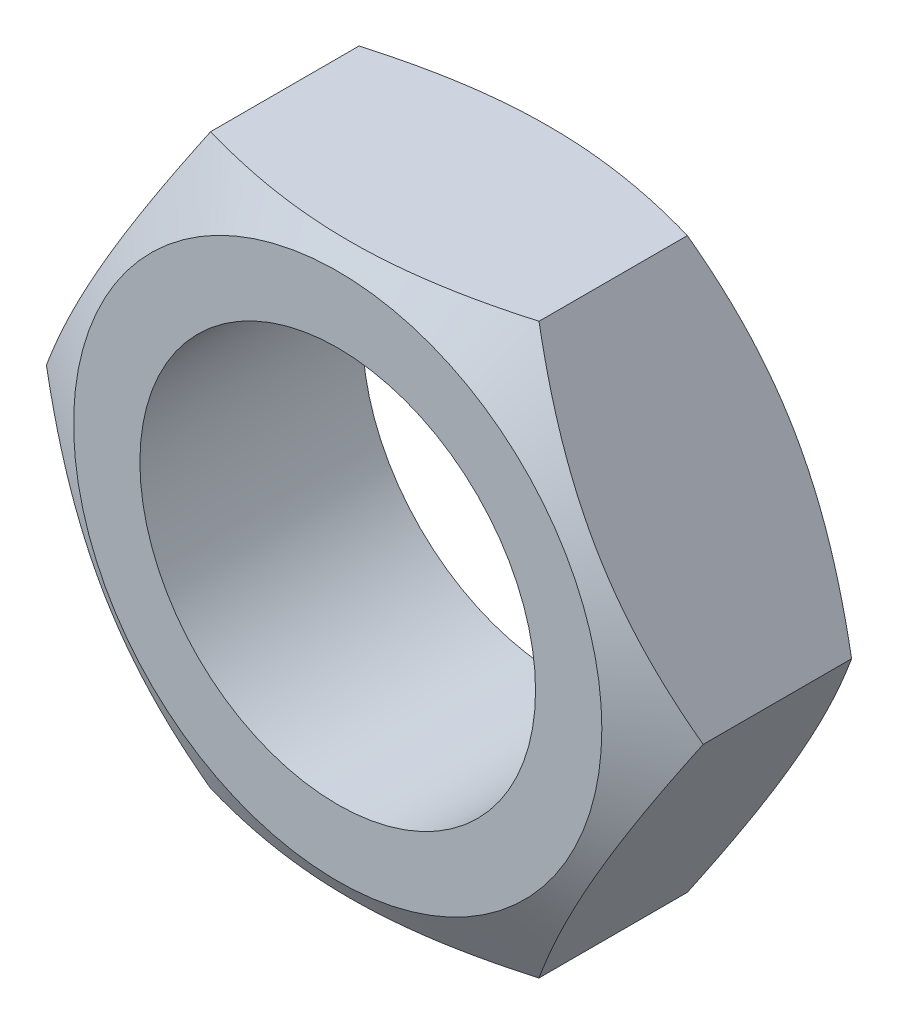
ISO-10303-21;
HEADER;
FILE_DESCRIPTION(('STEP AP214'),'2;1');
FILE_NAME('part.step','',(''),(''),'','','');
FILE_SCHEMA(('AUTOMOTIVE_DESIGN { 1 0 10303 214 1 1 1 1 }'));
ENDSEC;
DATA;
#1=APPLICATION_CONTEXT('core data for automotive mechanical design processes');
#2=APPLICATION_PROTOCOL_DEFINITION('international standard','automotive_design',2000,#1);
#3=PRODUCT_CONTEXT('',#1,'mechanical');
#4=PRODUCT('Part','Part','',(#3));
#5=PRODUCT_RELATED_PRODUCT_CATEGORY('part','',(#4));
#6=PRODUCT_DEFINITION_FORMATION('','',#4);
#7=PRODUCT_DEFINITION_CONTEXT('part definition',#1,'design');
#8=PRODUCT_DEFINITION('design','',#6,#7);
#9=PRODUCT_DEFINITION_SHAPE('','',#8);
#10=(LENGTH_UNIT() NAMED_UNIT(*) SI_UNIT(.MILLI.,.METRE.));
#11=(NAMED_UNIT(*) PLANE_ANGLE_UNIT() SI_UNIT($,.RADIAN.));
#12=(NAMED_UNIT(*) SI_UNIT($,.STERADIAN.) SOLID_ANGLE_UNIT());
#13=UNCERTAINTY_MEASURE_WITH_UNIT(LENGTH_MEASURE(1.E-05),#10,'distance_accuracy_value','');
#14=(GEOMETRIC_REPRESENTATION_CONTEXT(3) GLOBAL_UNCERTAINTY_ASSIGNED_CONTEXT((#13)) GLOBAL_UNIT_ASSIGNED_CONTEXT((#10,
#11,#12)) REPRESENTATION_CONTEXT('',''));
#15=CARTESIAN_POINT('',(0.,0.,0.));
#16=DIRECTION('',(0.,0.,1.));
#17=DIRECTION('',(1.,0.,0.));
#18=AXIS2_PLACEMENT_3D('',#15,#16,#17);
#19=CARTESIAN_POINT('',(13.2790561913614,-23.,18.));
#20=DIRECTION('',(-0.866025403784439,0.5,0.));
#21=DIRECTION('',(-0.5,-0.866025403784439,0.));
#22=AXIS2_PLACEMENT_3D('',#19,#20,#21);
#23=PLANE('',#22);
#24=CARTESIAN_POINT('',(13.2789407213076,-23.0002,14.9999333328986));
#25=CARTESIAN_POINT('',(13.5708086390754,-22.4946699373268,15.1684311500881));
#26=CARTESIAN_POINT('',(13.8638149971431,-21.9871680382127,15.3292827502776));
#27=CARTESIAN_POINT('',(14.4521772730397,-20.9680946831029,15.6335681487935));
#28=CARTESIAN_POINT('',(14.7475339297949,-20.4565219472494,15.7769962184533));
#29=CARTESIAN_POINT('',(15.3411739231066,-19.4283073174286,16.0445094164699));
#30=CARTESIAN_POINT('',(15.6394625019543,-18.9116563435469,16.168548352739));
#31=CARTESIAN_POINT('',(16.2380996675841,-17.874786357377,16.3946111991832));
#32=CARTESIAN_POINT('',(16.5384480460728,-17.3545677058636,16.4966373024589));
#33=CARTESIAN_POINT('',(17.133527657097,-16.3238595850214,16.6743436250418));
#34=CARTESIAN_POINT('',(17.4282147495145,-15.8134465686196,16.7506115189277));
#35=CARTESIAN_POINT('',(18.0189392134896,-14.7902817837407,16.8784953888596));
#36=CARTESIAN_POINT('',(18.3149766109281,-14.2775299704369,16.9301108903824));
#37=CARTESIAN_POINT('',(18.9075486924775,-13.2511650180465,17.0073867100464));
#38=CARTESIAN_POINT('',(19.2040823642676,-12.737553632351,17.0330778703644));
#39=CARTESIAN_POINT('',(19.7974233553189,-11.7098568896369,17.0579525253295));
#40=CARTESIAN_POINT('',(20.0942306658406,-11.1957715477555,17.0571368390891));
#41=CARTESIAN_POINT('',(20.649116836706,-10.2346805073992,17.0308491695729));
#42=CARTESIAN_POINT('',(20.9072352164226,-9.78760635936282,17.0085827357041));
#43=CARTESIAN_POINT('',(21.422855752054,-8.89452539422335,16.9444254503425));
#44=CARTESIAN_POINT('',(21.6803579167418,-8.448518561925,16.9025348799277));
#45=CARTESIAN_POINT('',(22.1946508831217,-7.55773701417968,16.7998553300411));
#46=CARTESIAN_POINT('',(22.4514408288437,-7.11296378131638,16.7390492612679));
#47=CARTESIAN_POINT('',(22.9637911641509,-6.22554696928937,16.5996148803772));
#48=CARTESIAN_POINT('',(23.219351558941,-5.78290338111062,16.520986643771));
#49=CARTESIAN_POINT('',(23.9951784974309,-4.4391317057654,16.2563508086476));
#50=CARTESIAN_POINT('',(24.5132407774459,-3.54182151529441,16.0439416496698));
#51=CARTESIAN_POINT('',(25.2846129731117,-2.20576568085543,15.6823250215795));
#52=CARTESIAN_POINT('',(25.5405624650353,-1.76244815667232,15.5547491239787));
#53=CARTESIAN_POINT('',(26.0506910811774,-0.878879475119287,15.2866818418769));
#54=CARTESIAN_POINT('',(26.3048706827756,-0.438627490903579,15.1461940976301));
#55=CARTESIAN_POINT('',(26.5582278527766,0.00020000000000843,14.9999333328986));
#56=B_SPLINE_CURVE_WITH_KNOTS('',3,(#24,#25,#26,#27,#28,#29,#30,#31,#32,#33,#34,#35,#36,#37,#38,
#39,#40,#41,#42,#43,#44,#45,#46,#47,#48,#49,#50,#51,#52,#53,#54,#55),.UNSPECIFIED.,.F.,.F.,(4,2,
2,2,2,2,2,2,2,2,2,2,2,2,2,4),(0.,1.82275209583971,3.64610187987774,5.47373144334345,
7.30117883905959,9.08355891739023,10.8659733025976,12.6462646412199,14.4265009654718,
15.9762768881921,17.5260306140232,19.0771885590146,20.6283399319781,23.7989683744784,
25.381520854309,26.9636285236953),.UNSPECIFIED.);
#57=CARTESIAN_POINT('',(13.2790561913614,-23.,15.));
#58=VERTEX_POINT('',#57);
#59=CARTESIAN_POINT('',(26.5581123827228,0.,15.));
#60=VERTEX_POINT('',#59);
#61=EDGE_CURVE('E118',#58,#60,#56,.T.);
#62=ORIENTED_EDGE('',*,*,#61,.F.);
#63=DIRECTION('',(0.,0.,-1.));
#64=VECTOR('',#63,1.);
#65=CARTESIAN_POINT('',(13.2790561913614,-23.,18.));
#66=LINE('',#65,#64);
#67=CARTESIAN_POINT('',(13.2790561913614,-23.,3.));
#68=VERTEX_POINT('',#67);
#69=EDGE_CURVE('E59',#58,#68,#66,.T.);
#70=ORIENTED_EDGE('',*,*,#69,.T.);
#71=CARTESIAN_POINT('',(26.5582278527766,0.000200000000010424,3.00006666710144));
#72=CARTESIAN_POINT('',(26.2663599350088,-0.505330062673206,2.83156884991187));
#73=CARTESIAN_POINT('',(25.973353576941,-1.0128319617873,2.6707172497224));
#74=CARTESIAN_POINT('',(25.3849913010444,-2.03190531689706,2.36643185120651));
#75=CARTESIAN_POINT('',(25.0896346442893,-2.54347805275061,2.22300378154669));
#76=CARTESIAN_POINT('',(24.4959946509776,-3.57169268257137,1.95549058353011));
#77=CARTESIAN_POINT('',(24.1977060721299,-4.08834365645311,1.83145164726097));
#78=CARTESIAN_POINT('',(23.5990689065001,-5.12521364262297,1.60538880081676));
#79=CARTESIAN_POINT('',(23.2987205280114,-5.64543229413634,1.50336269754107));
#80=CARTESIAN_POINT('',(22.7036409169871,-6.6761404149786,1.3256563749582));
#81=CARTESIAN_POINT('',(22.4089538245697,-7.18655343138034,1.24938848107225));
#82=CARTESIAN_POINT('',(21.8182293605945,-8.20971821625925,1.12150461114035));
#83=CARTESIAN_POINT('',(21.5221919631561,-8.72247002956313,1.06988910961759));
#84=CARTESIAN_POINT('',(20.9296198816067,-9.74883498195348,0.992613289953571));
#85=CARTESIAN_POINT('',(20.6330862098165,-10.262446367649,0.966922129635622));
#86=CARTESIAN_POINT('',(20.0397452187653,-11.290143110363,0.942047474670531));
#87=CARTESIAN_POINT('',(19.7429379082436,-11.8042284522445,0.942863160910905));
#88=CARTESIAN_POINT('',(19.1880517373781,-12.7653194926008,0.969150830427096));
#89=CARTESIAN_POINT('',(18.9299333576616,-13.2123936406372,0.99141726429585));
#90=CARTESIAN_POINT('',(18.4143128220302,-14.1054746057766,1.05557454965751));
#91=CARTESIAN_POINT('',(18.1568106573423,-14.551481438075,1.09746512007229));
#92=CARTESIAN_POINT('',(17.6425176909624,-15.4422629858203,1.20014466995887));
#93=CARTESIAN_POINT('',(17.3857277452405,-15.8870362186836,1.2609507387321));
#94=CARTESIAN_POINT('',(16.8733774099333,-16.7744530307106,1.40038511962281));
#95=CARTESIAN_POINT('',(16.6178170151432,-17.2170966188894,1.47901335622898));
#96=CARTESIAN_POINT('',(15.8419900766533,-18.5608682942346,1.74364919135235));
#97=CARTESIAN_POINT('',(15.3239277966382,-19.4581784847056,1.95605835033017));
#98=CARTESIAN_POINT('',(14.5525556009725,-20.7942343191445,2.31767497842047));
#99=CARTESIAN_POINT('',(14.2966061090489,-21.2375518433277,2.44525087602128));
#100=CARTESIAN_POINT('',(13.7864774929068,-22.1211205248807,2.71331815812313));
#101=CARTESIAN_POINT('',(13.5322978913085,-22.5613725090964,2.85380590236989));
#102=CARTESIAN_POINT('',(13.2789407213076,-23.0002,3.00006666710144));
#103=B_SPLINE_CURVE_WITH_KNOTS('',3,(#71,#72,#73,#74,#75,#76,#77,#78,#79,#80,#81,#82,#83,#84,
#85,#86,#87,#88,#89,#90,#91,#92,#93,#94,#95,#96,#97,#98,#99,#100,#101,#102),.UNSPECIFIED.,.F.,
.F.,(4,2,2,2,2,2,2,2,2,2,2,2,2,2,2,4),(0.,1.82275209583971,3.64610187987774,5.47373144334345,
7.30117883905959,9.08355891739023,10.8659733025976,12.6462646412199,14.4265009654718,
15.9762768881921,17.5260306140232,19.0771885590146,20.6283399319781,23.7989683744784,
25.381520854309,26.9636285236953),.UNSPECIFIED.);
#104=CARTESIAN_POINT('',(26.5581123827228,0.,3.));
#105=VERTEX_POINT('',#104);
#106=EDGE_CURVE('E199',#105,#68,#103,.T.);
#107=ORIENTED_EDGE('',*,*,#106,.F.);
#108=DIRECTION('',(0.,0.,-1.));
#109=VECTOR('',#108,1.);
#110=CARTESIAN_POINT('',(26.5581123827228,0.,18.));
#111=LINE('',#110,#109);
#112=EDGE_CURVE('E11',#60,#105,#111,.T.);
#113=ORIENTED_EDGE('',*,*,#112,.F.);
#114=EDGE_LOOP('',(#62,#70,#107,#113));
#115=FACE_BOUND('',#114,.T.);
#116=ADVANCED_FACE('F34',(#115),#23,.F.);
#117=CARTESIAN_POINT('',(26.5581123827228,0.,18.));
#118=DIRECTION('',(-0.866025403784438,-0.5,0.));
#119=DIRECTION('',(0.5,-0.866025403784439,0.));
#120=AXIS2_PLACEMENT_3D('',#117,#118,#119);
#121=PLANE('',#120);
#122=CARTESIAN_POINT('',(26.5582278527766,-0.000199999999989663,14.9999333328986));
#123=CARTESIAN_POINT('',(26.2663599350088,0.505330062673227,15.1684311500881));
#124=CARTESIAN_POINT('',(25.973353576941,1.01283196178732,15.3292827502776));
#125=CARTESIAN_POINT('',(25.3849913010444,2.03190531689708,15.6335681487935));
#126=CARTESIAN_POINT('',(25.0896346442893,2.54347805275063,15.7769962184533));
#127=CARTESIAN_POINT('',(24.4959946509776,3.57169268257139,16.0445094164699));
#128=CARTESIAN_POINT('',(24.1977060721299,4.08834365645313,16.168548352739));
#129=CARTESIAN_POINT('',(23.5990689065001,5.12521364262299,16.3946111991832));
#130=CARTESIAN_POINT('',(23.2987205280114,5.64543229413636,16.4966373024589));
#131=CARTESIAN_POINT('',(22.7036409169871,6.67614041497862,16.6743436250418));
#132=CARTESIAN_POINT('',(22.4089538245697,7.18655343138036,16.7506115189277));
#133=CARTESIAN_POINT('',(21.8182293605945,8.20971821625927,16.8784953888596));
#134=CARTESIAN_POINT('',(21.5221919631561,8.72247002956314,16.9301108903824));
#135=CARTESIAN_POINT('',(20.9296198816067,9.74883498195349,17.0073867100464));
#136=CARTESIAN_POINT('',(20.6330862098165,10.262446367649,17.0330778703644));
#137=CARTESIAN_POINT('',(20.0397452187653,11.2901431103631,17.0579525253295));
#138=CARTESIAN_POINT('',(19.7429379082436,11.8042284522445,17.0571368390891));
#139=CARTESIAN_POINT('',(19.1880517373781,12.7653194926008,17.0308491695729));
#140=CARTESIAN_POINT('',(18.9299333576616,13.2123936406372,17.0085827357041));
#141=CARTESIAN_POINT('',(18.4143128220302,14.1054746057766,16.9444254503425));
#142=CARTESIAN_POINT('',(18.1568106573423,14.551481438075,16.9025348799277));
#143=CARTESIAN_POINT('',(17.6425176909624,15.4422629858203,16.7998553300411));
#144=CARTESIAN_POINT('',(17.3857277452405,15.8870362186836,16.7390492612679));
#145=CARTESIAN_POINT('',(16.8733774099333,16.7744530307106,16.5996148803772));
#146=CARTESIAN_POINT('',(16.6178170151432,17.2170966188894,16.520986643771));
#147=CARTESIAN_POINT('',(15.8419900766533,18.5608682942346,16.2563508086476));
#148=CARTESIAN_POINT('',(15.3239277966382,19.4581784847056,16.0439416496698));
#149=CARTESIAN_POINT('',(14.5525556009725,20.7942343191446,15.6823250215795));
#150=CARTESIAN_POINT('',(14.2966061090489,21.2375518433277,15.5547491239787));
#151=CARTESIAN_POINT('',(13.7864774929068,22.1211205248807,15.2866818418769));
#152=CARTESIAN_POINT('',(13.5322978913085,22.5613725090964,15.1461940976301));
#153=CARTESIAN_POINT('',(13.2789407213076,23.0002,14.9999333328986));
#154=B_SPLINE_CURVE_WITH_KNOTS('',3,(#122,#123,#124,#125,#126,#127,#128,#129,#130,#131,#132,
#133,#134,#135,#136,#137,#138,#139,#140,#141,#142,#143,#144,#145,#146,#147,#148,#149,#150,#151,
#152,#153),.UNSPECIFIED.,.F.,.F.,(4,2,2,2,2,2,2,2,2,2,2,2,2,2,2,4),(0.,1.82275209583972,
3.64610187987774,5.47373144334345,7.3011788390596,9.08355891739023,10.8659733025976,
12.6462646412199,14.4265009654718,15.9762768881921,17.5260306140232,19.0771885590146,
20.6283399319781,23.7989683744784,25.381520854309,26.9636285236953),.UNSPECIFIED.);
#155=CARTESIAN_POINT('',(13.2790561913614,23.,15.));
#156=VERTEX_POINT('',#155);
#157=EDGE_CURVE('E124',#60,#156,#154,.T.);
#158=ORIENTED_EDGE('',*,*,#157,.F.);
#159=ORIENTED_EDGE('',*,*,#112,.T.);
#160=CARTESIAN_POINT('',(13.2789407213076,23.0002,3.00006666710144));
#161=CARTESIAN_POINT('',(13.5708086390754,22.4946699373268,2.83156884991187));
#162=CARTESIAN_POINT('',(13.8638149971431,21.9871680382127,2.6707172497224));
#163=CARTESIAN_POINT('',(14.4521772730397,20.9680946831029,2.36643185120652));
#164=CARTESIAN_POINT('',(14.7475339297949,20.4565219472494,2.2230037815467));
#165=CARTESIAN_POINT('',(15.3411739231066,19.4283073174286,1.95549058353011));
#166=CARTESIAN_POINT('',(15.6394625019543,18.9116563435469,1.83145164726097));
#167=CARTESIAN_POINT('',(16.2380996675841,17.874786357377,1.60538880081676));
#168=CARTESIAN_POINT('',(16.5384480460728,17.3545677058637,1.50336269754107));
#169=CARTESIAN_POINT('',(17.133527657097,16.3238595850214,1.3256563749582));
#170=CARTESIAN_POINT('',(17.4282147495145,15.8134465686196,1.24938848107225));
#171=CARTESIAN_POINT('',(18.0189392134896,14.7902817837407,1.12150461114036));
#172=CARTESIAN_POINT('',(18.3149766109281,14.2775299704369,1.0698891096176));
#173=CARTESIAN_POINT('',(18.9075486924775,13.2511650180465,0.992613289953573));
#174=CARTESIAN_POINT('',(19.2040823642676,12.737553632351,0.966922129635625));
#175=CARTESIAN_POINT('',(19.7974233553189,11.709856889637,0.942047474670535));
#176=CARTESIAN_POINT('',(20.0942306658406,11.1957715477555,0.942863160910909));
#177=CARTESIAN_POINT('',(20.649116836706,10.2346805073992,0.9691508304271));
#178=CARTESIAN_POINT('',(20.9072352164226,9.78760635936282,0.991417264295855));
#179=CARTESIAN_POINT('',(21.422855752054,8.89452539422336,1.05557454965751));
#180=CARTESIAN_POINT('',(21.6803579167418,8.448518561925,1.0974651200723));
#181=CARTESIAN_POINT('',(22.1946508831217,7.55773701417969,1.20014466995888));
#182=CARTESIAN_POINT('',(22.4514408288437,7.11296378131639,1.26095073873211));
#183=CARTESIAN_POINT('',(22.9637911641509,6.22554696928938,1.40038511962281));
#184=CARTESIAN_POINT('',(23.219351558941,5.78290338111063,1.47901335622898));
#185=CARTESIAN_POINT('',(23.9951784974309,4.43913170576541,1.74364919135235));
#186=CARTESIAN_POINT('',(24.5132407774459,3.54182151529442,1.95605835033017));
#187=CARTESIAN_POINT('',(25.2846129731117,2.20576568085545,2.31767497842048));
#188=CARTESIAN_POINT('',(25.5405624650353,1.76244815667234,2.44525087602128));
#189=CARTESIAN_POINT('',(26.0506910811774,0.878879475119303,2.71331815812313));
#190=CARTESIAN_POINT('',(26.3048706827756,0.438627490903594,2.85380590236989));
#191=CARTESIAN_POINT('',(26.5582278527766,-0.000199999999991145,3.00006666710144));
#192=B_SPLINE_CURVE_WITH_KNOTS('',3,(#160,#161,#162,#163,#164,#165,#166,#167,#168,#169,#170,
#171,#172,#173,#174,#175,#176,#177,#178,#179,#180,#181,#182,#183,#184,#185,#186,#187,#188,#189,
#190,#191),.UNSPECIFIED.,.F.,.F.,(4,2,2,2,2,2,2,2,2,2,2,2,2,2,2,4),(0.,1.82275209583971,
3.64610187987774,5.47373144334345,7.30117883905959,9.08355891739024,10.8659733025976,
12.6462646412199,14.4265009654718,15.9762768881921,17.5260306140232,19.0771885590146,
20.6283399319781,23.7989683744784,25.381520854309,26.9636285236953),.UNSPECIFIED.);
#193=CARTESIAN_POINT('',(13.2790561913614,23.,3.));
#194=VERTEX_POINT('',#193);
#195=EDGE_CURVE('E190',#194,#105,#192,.T.);
#196=ORIENTED_EDGE('',*,*,#195,.F.);
#197=DIRECTION('',(0.,0.,-1.));
#198=VECTOR('',#197,1.);
#199=CARTESIAN_POINT('',(13.2790561913614,23.,18.));
#200=LINE('',#199,#198);
#201=EDGE_CURVE('E43',#156,#194,#200,.T.);
#202=ORIENTED_EDGE('',*,*,#201,.F.);
#203=EDGE_LOOP('',(#158,#159,#196,#202));
#204=FACE_BOUND('',#203,.T.);
#205=ADVANCED_FACE('F177',(#204),#121,.F.);
#206=CARTESIAN_POINT('',(13.2790561913614,23.,18.));
#207=DIRECTION('',(0.,-1.,0.));
#208=DIRECTION('',(0.,0.,-1.));
#209=AXIS2_PLACEMENT_3D('',#206,#207,#208);
#210=PLANE('',#209);
#211=CARTESIAN_POINT('',(-35.0870102638158,23.,6.11145417933209));
#212=CARTESIAN_POINT('',(-34.5826208070535,23.,6.35499395481444));
#213=CARTESIAN_POINT('',(-34.0776175453694,23.,6.59726641183304));
#214=CARTESIAN_POINT('',(-33.066254573679,23.,7.07897724782745));
#215=CARTESIAN_POINT('',(-32.5598948486099,23.,7.31841559517038));
#216=CARTESIAN_POINT('',(-31.5456140631373,23.,7.79419427268393));
#217=CARTESIAN_POINT('',(-31.0376927489694,23.,8.03053406246504));
#218=CARTESIAN_POINT('',(-30.0202381421211,23.,8.49971179817281));
#219=CARTESIAN_POINT('',(-29.5107048536061,23.,8.73254975313911));
#220=CARTESIAN_POINT('',(-27.9735447346536,23.,9.42790121530757));
#221=CARTESIAN_POINT('',(-26.9432234823464,23.,9.88448998427264));
#222=CARTESIAN_POINT('',(-24.8740716767846,23.,10.7778765904088));
#223=CARTESIAN_POINT('',(-23.835241574994,23.,11.2146754696655));
#224=CARTESIAN_POINT('',(-21.7351280648587,23.,12.0681332490483));
#225=CARTESIAN_POINT('',(-20.6737241304653,23.,12.4844971769752));
#226=CARTESIAN_POINT('',(-18.5383435121159,23.,13.2842887099424));
#227=CARTESIAN_POINT('',(-17.4643654398053,23.,13.6677126382404));
#228=CARTESIAN_POINT('',(-15.3044129526532,23.,14.391220619646));
#229=CARTESIAN_POINT('',(-14.218470050291,23.,14.7313979715252));
#230=CARTESIAN_POINT('',(-12.0310473902645,23.,15.3572964215856));
#231=CARTESIAN_POINT('',(-10.9295726996772,23.,15.6430348577425));
#232=CARTESIAN_POINT('',(-9.26549333322495,23.,16.0202959772545));
#233=CARTESIAN_POINT('',(-8.7086752787049,23.,16.137515841311));
#234=CARTESIAN_POINT('',(-7.59135996992974,23.,16.3529720620529));
#235=CARTESIAN_POINT('',(-7.03086280008912,23.,16.4512088527271));
#236=CARTESIAN_POINT('',(-5.90657503801853,23.,16.626949953949));
#237=CARTESIAN_POINT('',(-5.34278424064571,23.,16.7044529587211));
#238=CARTESIAN_POINT('',(-4.21256575472712,23.,16.837165544952));
#239=CARTESIAN_POINT('',(-3.64613806269283,23.,16.8923750969088));
#240=CARTESIAN_POINT('',(-2.51499108548699,23.,16.9790214670379));
#241=CARTESIAN_POINT('',(-1.95028301062933,23.,17.0106036796063));
#242=CARTESIAN_POINT('',(-0.820039085335634,23.,17.0498313578921));
#243=CARTESIAN_POINT('',(-0.254503247385686,23.,17.0574771810213));
#244=CARTESIAN_POINT('',(0.876228814905451,23.,17.0486514474317));
#245=CARTESIAN_POINT('',(1.44142508974464,23.,17.0321864232202));
#246=CARTESIAN_POINT('',(2.57063208467138,23.,16.9755442634638));
#247=CARTESIAN_POINT('',(3.13464275134039,23.,16.9353660815485));
#248=CARTESIAN_POINT('',(4.5054433625132,23.,16.809730127194));
#249=CARTESIAN_POINT('',(5.31114283496014,23.,16.7121795103606));
#250=CARTESIAN_POINT('',(6.91618321701765,23.,16.4741456849366));
#251=CARTESIAN_POINT('',(7.71552314761322,23.,16.3336559924916));
#252=CARTESIAN_POINT('',(9.30827961432474,23.,16.0145252104805));
#253=CARTESIAN_POINT('',(10.1016795636317,23.,15.8358021177526));
#254=CARTESIAN_POINT('',(11.6803148451025,23.,15.4457476786366));
#255=CARTESIAN_POINT('',(12.4655504897687,23.,15.2344175852769));
#256=CARTESIAN_POINT('',(14.0461656871856,23.,14.7789684435667));
#257=CARTESIAN_POINT('',(14.8413574251323,23.,14.5342019938104));
#258=CARTESIAN_POINT('',(16.423950917171,23.,14.0205795122356));
#259=CARTESIAN_POINT('',(17.2113519672222,23.,13.7517213249427));
#260=CARTESIAN_POINT('',(18.7745722725163,23.,13.1955803242296));
#261=CARTESIAN_POINT('',(19.5504318607698,23.,12.9084104468081));
#262=CARTESIAN_POINT('',(20.7093447886555,23.,12.4653606062017));
#263=CARTESIAN_POINT('',(21.0947753369745,23.,12.3156529854605));
#264=CARTESIAN_POINT('',(21.8641412764255,23.,12.0124734583169));
#265=CARTESIAN_POINT('',(22.2480767090095,23.,11.8590016571498));
#266=CARTESIAN_POINT('',(22.6313194943702,23.,11.7038171286984));
#267=B_SPLINE_CURVE_WITH_KNOTS('',3,(#211,#212,#213,#214,#215,#216,#217,#218,#219,#220,#221,
#222,#223,#224,#225,#226,#227,#228,#229,#230,#231,#232,#233,#234,#235,#236,#237,#238,#239,#240,
#241,#242,#243,#244,#245,#246,#247,#248,#249,#250,#251,#252,#253,#254,#255,#256,#257,#258,#259,
#260,#261,#262,#263,#264,#265,#266),.UNSPECIFIED.,.F.,.F.,(4,2,2,2,2,2,2,2,2,2,2,2,2,2,2,2,2,2,
2,2,2,2,2,2,2,2,2,4),(0.,1.6803229522699,3.36066464178974,5.04129558625222,6.72192219158537,
10.1026247256346,13.4831490330354,16.9031743618009,20.3235809370342,23.7364784806677,
27.1482872440677,28.855083802464,30.561841335656,32.2687063320012,33.9755735871135,
35.6718489721969,37.3680990288191,39.0638895944962,40.7597549944805,43.1931476364914,
45.6269079055439,48.0659414075813,50.5048812052809,53.0004515268425,55.4962453490644,
57.9779083767782,59.2183447010781,60.4587463859323),.UNSPECIFIED.);
#268=CARTESIAN_POINT('',(-13.2790561913614,23.,15.));
#269=VERTEX_POINT('',#268);
#270=EDGE_CURVE('E91',#156,#269,#267,.F.);
#271=ORIENTED_EDGE('',*,*,#270,.F.);
#272=ORIENTED_EDGE('',*,*,#201,.T.);
#273=CARTESIAN_POINT('',(-35.0870102638158,23.,11.8885458206679));
#274=CARTESIAN_POINT('',(-34.5826208070535,23.,11.6450060451856));
#275=CARTESIAN_POINT('',(-34.0776175453694,23.,11.402733588167));
#276=CARTESIAN_POINT('',(-33.066254573679,23.,10.9210227521725));
#277=CARTESIAN_POINT('',(-32.5598948486099,23.,10.6815844048296));
#278=CARTESIAN_POINT('',(-31.5456140631373,23.,10.2058057273161));
#279=CARTESIAN_POINT('',(-31.0376927489694,23.,9.96946593753495));
#280=CARTESIAN_POINT('',(-30.0202381421211,23.,9.50028820182719));
#281=CARTESIAN_POINT('',(-29.510704853606,23.,9.26745024686088));
#282=CARTESIAN_POINT('',(-27.9735447346536,23.,8.57209878469243));
#283=CARTESIAN_POINT('',(-26.9432234823464,23.,8.11551001572735));
#284=CARTESIAN_POINT('',(-24.8740716767846,23.,7.22212340959119));
#285=CARTESIAN_POINT('',(-23.835241574994,23.,6.78532453033452));
#286=CARTESIAN_POINT('',(-21.7351280648587,23.,5.93186675095165));
#287=CARTESIAN_POINT('',(-20.6737241304653,23.,5.51550282302475));
#288=CARTESIAN_POINT('',(-18.5383435121159,23.,4.71571129005755));
#289=CARTESIAN_POINT('',(-17.4643654398053,23.,4.33228736175959));
#290=CARTESIAN_POINT('',(-15.3044129526532,23.,3.60877938035398));
#291=CARTESIAN_POINT('',(-14.218470050291,23.,3.26860202847476));
#292=CARTESIAN_POINT('',(-12.0310473902645,23.,2.64270357841437));
#293=CARTESIAN_POINT('',(-10.9295726996772,23.,2.35696514225747));
#294=CARTESIAN_POINT('',(-9.26549333322494,23.,1.97970402274551));
#295=CARTESIAN_POINT('',(-8.7086752787049,23.,1.862484158689));
#296=CARTESIAN_POINT('',(-7.59135996992974,23.,1.64702793794711));
#297=CARTESIAN_POINT('',(-7.03086280008911,23.,1.54879114727289));
#298=CARTESIAN_POINT('',(-5.90657503801852,23.,1.37305004605098));
#299=CARTESIAN_POINT('',(-5.34278424064571,23.,1.29554704127892));
#300=CARTESIAN_POINT('',(-4.21256575472712,23.,1.16283445504804));
#301=CARTESIAN_POINT('',(-3.64613806269282,23.,1.1076249030912));
#302=CARTESIAN_POINT('',(-2.51499108548699,23.,1.02097853296207));
#303=CARTESIAN_POINT('',(-1.95028301062933,23.,0.989396320393667));
#304=CARTESIAN_POINT('',(-0.820039085335632,23.,0.950168642107925));
#305=CARTESIAN_POINT('',(-0.254503247385684,23.,0.942522818978682));
#306=CARTESIAN_POINT('',(0.876228814905455,23.,0.9513485525683));
#307=CARTESIAN_POINT('',(1.44142508974465,23.,0.9678135767798));
#308=CARTESIAN_POINT('',(2.57063208467139,23.,1.0244557365362));
#309=CARTESIAN_POINT('',(3.13464275134039,23.,1.06463391845151));
#310=CARTESIAN_POINT('',(4.50544336251321,23.,1.19026987280598));
#311=CARTESIAN_POINT('',(5.31114283496015,23.,1.28782048963936));
#312=CARTESIAN_POINT('',(6.91618321701765,23.,1.52585431506335));
#313=CARTESIAN_POINT('',(7.71552314761323,23.,1.66634400750844));
#314=CARTESIAN_POINT('',(9.30827961432475,23.,1.9854747895195));
#315=CARTESIAN_POINT('',(10.1016795636317,23.,2.16419788224738));
#316=CARTESIAN_POINT('',(11.6803148451025,23.,2.55425232136337));
#317=CARTESIAN_POINT('',(12.4655504897687,23.,2.76558241472308));
#318=CARTESIAN_POINT('',(14.0461656871857,23.,3.22103155643328));
#319=CARTESIAN_POINT('',(14.8413574251323,23.,3.46579800618963));
#320=CARTESIAN_POINT('',(16.423950917171,23.,3.97942048776439));
#321=CARTESIAN_POINT('',(17.2113519672222,23.,4.24827867505727));
#322=CARTESIAN_POINT('',(18.7745722725163,23.,4.80441967577039));
#323=CARTESIAN_POINT('',(19.5504318607698,23.,5.09158955319193));
#324=CARTESIAN_POINT('',(20.7093447886555,23.,5.53463939379829));
#325=CARTESIAN_POINT('',(21.0947753369745,23.,5.68434701453951));
#326=CARTESIAN_POINT('',(21.8641412764255,23.,5.98752654168309));
#327=CARTESIAN_POINT('',(22.2480767090095,23.,6.14099834285023));
#328=CARTESIAN_POINT('',(22.6313194943702,23.,6.29618287130156));
#329=B_SPLINE_CURVE_WITH_KNOTS('',3,(#273,#274,#275,#276,#277,#278,#279,#280,#281,#282,#283,
#284,#285,#286,#287,#288,#289,#290,#291,#292,#293,#294,#295,#296,#297,#298,#299,#300,#301,#302,
#303,#304,#305,#306,#307,#308,#309,#310,#311,#312,#313,#314,#315,#316,#317,#318,#319,#320,#321,
#322,#323,#324,#325,#326,#327,#328),.UNSPECIFIED.,.F.,.F.,(4,2,2,2,2,2,2,2,2,2,2,2,2,2,2,2,2,2,
2,2,2,2,2,2,2,2,2,4),(0.,1.6803229522699,3.36066464178974,5.04129558625223,6.72192219158537,
10.1026247256346,13.4831490330354,16.9031743618009,20.3235809370342,23.7364784806677,
27.1482872440677,28.855083802464,30.561841335656,32.2687063320012,33.9755735871135,
35.6718489721969,37.3680990288191,39.0638895944962,40.7597549944805,43.1931476364913,
45.6269079055439,48.0659414075813,50.5048812052809,53.0004515268424,55.4962453490643,
57.9779083767782,59.2183447010781,60.4587463859323),.UNSPECIFIED.);
#330=CARTESIAN_POINT('',(-13.2790561913614,23.,3.));
#331=VERTEX_POINT('',#330);
#332=EDGE_CURVE('E183',#331,#194,#329,.T.);
#333=ORIENTED_EDGE('',*,*,#332,.F.);
#334=DIRECTION('',(0.,0.,-1.));
#335=VECTOR('',#334,1.);
#336=CARTESIAN_POINT('',(-13.2790561913614,23.,18.));
#337=LINE('',#336,#335);
#338=EDGE_CURVE('E109',#269,#331,#337,.T.);
#339=ORIENTED_EDGE('',*,*,#338,.F.);
#340=EDGE_LOOP('',(#271,#272,#333,#339));
#341=FACE_BOUND('',#340,.T.);
#342=ADVANCED_FACE('F174',(#341),#210,.F.);
#343=CARTESIAN_POINT('',(-13.2790561913614,23.,18.));
#344=DIRECTION('',(0.866025403784439,-0.5,0.));
#345=DIRECTION('',(0.5,0.866025403784439,0.));
#346=AXIS2_PLACEMENT_3D('',#343,#344,#345);
#347=PLANE('',#346);
#348=CARTESIAN_POINT('',(-13.2789407213076,23.0002,14.9999333328985));
#349=CARTESIAN_POINT('',(-13.5708086390754,22.4946699373268,15.1684311500881));
#350=CARTESIAN_POINT('',(-13.8638149971431,21.9871680382127,15.3292827502776));
#351=CARTESIAN_POINT('',(-14.4521772730397,20.9680946831029,15.6335681487935));
#352=CARTESIAN_POINT('',(-14.7475339297949,20.4565219472494,15.7769962184533));
#353=CARTESIAN_POINT('',(-15.3411739231066,19.4283073174286,16.0445094164699));
#354=CARTESIAN_POINT('',(-15.6394625019543,18.9116563435469,16.168548352739));
#355=CARTESIAN_POINT('',(-16.2380996675841,17.874786357377,16.3946111991832));
#356=CARTESIAN_POINT('',(-16.5384480460728,17.3545677058637,16.4966373024589));
#357=CARTESIAN_POINT('',(-17.133527657097,16.3238595850214,16.6743436250418));
#358=CARTESIAN_POINT('',(-17.4282147495145,15.8134465686196,16.7506115189277));
#359=CARTESIAN_POINT('',(-18.0189392134896,14.7902817837407,16.8784953888596));
#360=CARTESIAN_POINT('',(-18.3149766109281,14.2775299704369,16.9301108903824));
#361=CARTESIAN_POINT('',(-18.9075486924775,13.2511650180465,17.0073867100464));
#362=CARTESIAN_POINT('',(-19.2040823642676,12.737553632351,17.0330778703644));
#363=CARTESIAN_POINT('',(-19.7974233553189,11.709856889637,17.0579525253295));
#364=CARTESIAN_POINT('',(-20.0942306658406,11.1957715477555,17.0571368390891));
#365=CARTESIAN_POINT('',(-20.649116836706,10.2346805073992,17.0308491695729));
#366=CARTESIAN_POINT('',(-20.9072352164226,9.78760635936282,17.0085827357041));
#367=CARTESIAN_POINT('',(-21.422855752054,8.89452539422336,16.9444254503425));
#368=CARTESIAN_POINT('',(-21.6803579167418,8.448518561925,16.9025348799277));
#369=CARTESIAN_POINT('',(-22.1946508831217,7.55773701417969,16.7998553300411));
#370=CARTESIAN_POINT('',(-22.4514408288437,7.11296378131639,16.7390492612679));
#371=CARTESIAN_POINT('',(-22.9637911641509,6.22554696928938,16.5996148803772));
#372=CARTESIAN_POINT('',(-23.219351558941,5.78290338111063,16.520986643771));
#373=CARTESIAN_POINT('',(-23.9951784974309,4.43913170576541,16.2563508086476));
#374=CARTESIAN_POINT('',(-24.5132407774459,3.54182151529441,16.0439416496698));
#375=CARTESIAN_POINT('',(-25.2846129731117,2.20576568085544,15.6823250215795));
#376=CARTESIAN_POINT('',(-25.5405624650353,1.76244815667233,15.5547491239787));
#377=CARTESIAN_POINT('',(-26.0506910811774,0.878879475119295,15.2866818418769));
#378=CARTESIAN_POINT('',(-26.3048706827756,0.438627490903585,15.1461940976301));
#379=CARTESIAN_POINT('',(-26.5582278527766,-0.000199999999999849,14.9999333328986));
#380=B_SPLINE_CURVE_WITH_KNOTS('',3,(#348,#349,#350,#351,#352,#353,#354,#355,#356,#357,#358,
#359,#360,#361,#362,#363,#364,#365,#366,#367,#368,#369,#370,#371,#372,#373,#374,#375,#376,#377,
#378,#379),.UNSPECIFIED.,.F.,.F.,(4,2,2,2,2,2,2,2,2,2,2,2,2,2,2,4),(0.,1.82275209583972,
3.64610187987773,5.47373144334345,7.3011788390596,9.08355891739023,10.8659733025976,
12.6462646412199,14.4265009654718,15.9762768881921,17.5260306140232,19.0771885590146,
20.6283399319781,23.7989683744784,25.381520854309,26.9636285236953),.UNSPECIFIED.);
#381=CARTESIAN_POINT('',(-26.5581123827228,0.,15.));
#382=VERTEX_POINT('',#381);
#383=EDGE_CURVE('E88',#269,#382,#380,.T.);
#384=ORIENTED_EDGE('',*,*,#383,.F.);
#385=ORIENTED_EDGE('',*,*,#338,.T.);
#386=CARTESIAN_POINT('',(-26.5582278527766,-0.000199999999998285,3.00006666710144));
#387=CARTESIAN_POINT('',(-26.2663599350088,0.505330062673216,2.83156884991187));
#388=CARTESIAN_POINT('',(-25.973353576941,1.01283196178731,2.6707172497224));
#389=CARTESIAN_POINT('',(-25.3849913010444,2.03190531689708,2.36643185120651));
#390=CARTESIAN_POINT('',(-25.0896346442893,2.54347805275062,2.22300378154669));
#391=CARTESIAN_POINT('',(-24.4959946509776,3.57169268257138,1.95549058353011));
#392=CARTESIAN_POINT('',(-24.1977060721299,4.08834365645312,1.83145164726097));
#393=CARTESIAN_POINT('',(-23.5990689065001,5.12521364262298,1.60538880081676));
#394=CARTESIAN_POINT('',(-23.2987205280114,5.64543229413635,1.50336269754107));
#395=CARTESIAN_POINT('',(-22.7036409169871,6.67614041497861,1.3256563749582));
#396=CARTESIAN_POINT('',(-22.4089538245697,7.18655343138035,1.24938848107225));
#397=CARTESIAN_POINT('',(-21.8182293605945,8.20971821625926,1.12150461114036));
#398=CARTESIAN_POINT('',(-21.5221919631561,8.72247002956314,1.06988910961759));
#399=CARTESIAN_POINT('',(-20.9296198816067,9.74883498195349,0.992613289953571));
#400=CARTESIAN_POINT('',(-20.6330862098165,10.262446367649,0.966922129635624));
#401=CARTESIAN_POINT('',(-20.0397452187653,11.290143110363,0.942047474670534));
#402=CARTESIAN_POINT('',(-19.7429379082436,11.8042284522445,0.942863160910908));
#403=CARTESIAN_POINT('',(-19.1880517373781,12.7653194926008,0.969150830427099));
#404=CARTESIAN_POINT('',(-18.9299333576616,13.2123936406372,0.991417264295854));
#405=CARTESIAN_POINT('',(-18.4143128220302,14.1054746057766,1.05557454965751));
#406=CARTESIAN_POINT('',(-18.1568106573423,14.551481438075,1.0974651200723));
#407=CARTESIAN_POINT('',(-17.6425176909624,15.4422629858203,1.20014466995888));
#408=CARTESIAN_POINT('',(-17.3857277452405,15.8870362186836,1.2609507387321));
#409=CARTESIAN_POINT('',(-16.8733774099333,16.7744530307106,1.40038511962281));
#410=CARTESIAN_POINT('',(-16.6178170151432,17.2170966188894,1.47901335622898));
#411=CARTESIAN_POINT('',(-15.8419900766533,18.5608682942346,1.74364919135235));
#412=CARTESIAN_POINT('',(-15.3239277966382,19.4581784847056,1.95605835033017));
#413=CARTESIAN_POINT('',(-14.5525556009725,20.7942343191446,2.31767497842047));
#414=CARTESIAN_POINT('',(-14.2966061090489,21.2375518433277,2.44525087602128));
#415=CARTESIAN_POINT('',(-13.7864774929068,22.1211205248807,2.71331815812313));
#416=CARTESIAN_POINT('',(-13.5322978913085,22.5613725090964,2.85380590236989));
#417=CARTESIAN_POINT('',(-13.2789407213076,23.0002,3.00006666710145));
#418=B_SPLINE_CURVE_WITH_KNOTS('',3,(#386,#387,#388,#389,#390,#391,#392,#393,#394,#395,#396,
#397,#398,#399,#400,#401,#402,#403,#404,#405,#406,#407,#408,#409,#410,#411,#412,#413,#414,#415,
#416,#417),.UNSPECIFIED.,.F.,.F.,(4,2,2,2,2,2,2,2,2,2,2,2,2,2,2,4),(0.,1.82275209583971,
3.64610187987774,5.47373144334345,7.30117883905959,9.08355891739023,10.8659733025976,
12.6462646412199,14.4265009654718,15.9762768881921,17.5260306140232,19.0771885590146,
20.6283399319781,23.7989683744784,25.381520854309,26.9636285236953),.UNSPECIFIED.);
#419=CARTESIAN_POINT('',(-26.5581123827228,0.,3.));
#420=VERTEX_POINT('',#419);
#421=EDGE_CURVE('E108',#420,#331,#418,.T.);
#422=ORIENTED_EDGE('',*,*,#421,.F.);
#423=DIRECTION('',(0.,0.,-1.));
#424=VECTOR('',#423,1.);
#425=CARTESIAN_POINT('',(-26.5581123827228,0.,18.));
#426=LINE('',#425,#424);
#427=EDGE_CURVE('E100',#382,#420,#426,.T.);
#428=ORIENTED_EDGE('',*,*,#427,.F.);
#429=EDGE_LOOP('',(#384,#385,#422,#428));
#430=FACE_BOUND('',#429,.T.);
#431=ADVANCED_FACE('F106',(#430),#347,.F.);
#432=CARTESIAN_POINT('',(-26.5581123827228,0.,18.));
#433=DIRECTION('',(0.866025403784439,0.5,0.));
#434=DIRECTION('',(-0.5,0.866025403784439,0.));
#435=AXIS2_PLACEMENT_3D('',#432,#433,#434);
#436=PLANE('',#435);
#437=CARTESIAN_POINT('',(-26.5582278527766,0.000200000000001802,14.9999333328986));
#438=CARTESIAN_POINT('',(-26.2663599350088,-0.505330062673215,15.1684311500881));
#439=CARTESIAN_POINT('',(-25.973353576941,-1.0128319617873,15.3292827502776));
#440=CARTESIAN_POINT('',(-25.3849913010444,-2.03190531689707,15.6335681487935));
#441=CARTESIAN_POINT('',(-25.0896346442893,-2.54347805275061,15.7769962184533));
#442=CARTESIAN_POINT('',(-24.4959946509776,-3.57169268257138,16.0445094164699));
#443=CARTESIAN_POINT('',(-24.1977060721299,-4.08834365645312,16.168548352739));
#444=CARTESIAN_POINT('',(-23.5990689065001,-5.12521364262298,16.3946111991832));
#445=CARTESIAN_POINT('',(-23.2987205280114,-5.64543229413634,16.4966373024589));
#446=CARTESIAN_POINT('',(-22.7036409169871,-6.6761404149786,16.6743436250418));
#447=CARTESIAN_POINT('',(-22.4089538245697,-7.18655343138035,16.7506115189277));
#448=CARTESIAN_POINT('',(-21.8182293605945,-8.20971821625925,16.8784953888596));
#449=CARTESIAN_POINT('',(-21.5221919631561,-8.72247002956313,16.9301108903824));
#450=CARTESIAN_POINT('',(-20.9296198816067,-9.74883498195348,17.0073867100464));
#451=CARTESIAN_POINT('',(-20.6330862098165,-10.262446367649,17.0330778703644));
#452=CARTESIAN_POINT('',(-20.0397452187653,-11.290143110363,17.0579525253295));
#453=CARTESIAN_POINT('',(-19.7429379082436,-11.8042284522445,17.0571368390891));
#454=CARTESIAN_POINT('',(-19.1880517373781,-12.7653194926008,17.0308491695729));
#455=CARTESIAN_POINT('',(-18.9299333576616,-13.2123936406372,17.0085827357041));
#456=CARTESIAN_POINT('',(-18.4143128220302,-14.1054746057766,16.9444254503425));
#457=CARTESIAN_POINT('',(-18.1568106573423,-14.551481438075,16.9025348799277));
#458=CARTESIAN_POINT('',(-17.6425176909624,-15.4422629858203,16.7998553300411));
#459=CARTESIAN_POINT('',(-17.3857277452405,-15.8870362186836,16.7390492612679));
#460=CARTESIAN_POINT('',(-16.8733774099333,-16.7744530307106,16.5996148803772));
#461=CARTESIAN_POINT('',(-16.6178170151432,-17.2170966188894,16.520986643771));
#462=CARTESIAN_POINT('',(-15.8419900766532,-18.5608682942346,16.2563508086476));
#463=CARTESIAN_POINT('',(-15.3239277966382,-19.4581784847056,16.0439416496698));
#464=CARTESIAN_POINT('',(-14.5525556009725,-20.7942343191445,15.6823250215795));
#465=CARTESIAN_POINT('',(-14.2966061090489,-21.2375518433277,15.5547491239787));
#466=CARTESIAN_POINT('',(-13.7864774929067,-22.1211205248807,15.2866818418769));
#467=CARTESIAN_POINT('',(-13.5322978913085,-22.5613725090964,15.1461940976301));
#468=CARTESIAN_POINT('',(-13.2789407213075,-23.0002,14.9999333328986));
#469=B_SPLINE_CURVE_WITH_KNOTS('',3,(#437,#438,#439,#440,#441,#442,#443,#444,#445,#446,#447,
#448,#449,#450,#451,#452,#453,#454,#455,#456,#457,#458,#459,#460,#461,#462,#463,#464,#465,#466,
#467,#468),.UNSPECIFIED.,.F.,.F.,(4,2,2,2,2,2,2,2,2,2,2,2,2,2,2,4),(0.,1.82275209583971,
3.64610187987774,5.47373144334345,7.30117883905959,9.08355891739023,10.8659733025976,
12.6462646412199,14.4265009654718,15.9762768881921,17.5260306140232,19.0771885590146,
20.6283399319781,23.7989683744784,25.381520854309,26.9636285236953),.UNSPECIFIED.);
#470=CARTESIAN_POINT('',(-13.2790561913614,-23.,15.));
#471=VERTEX_POINT('',#470);
#472=EDGE_CURVE('E51',#382,#471,#469,.T.);
#473=ORIENTED_EDGE('',*,*,#472,.F.);
#474=ORIENTED_EDGE('',*,*,#427,.T.);
#475=CARTESIAN_POINT('',(-13.2789407213075,-23.0002,3.00006666710144));
#476=CARTESIAN_POINT('',(-13.5708086390754,-22.4946699373268,2.83156884991187));
#477=CARTESIAN_POINT('',(-13.8638149971431,-21.9871680382127,2.6707172497224));
#478=CARTESIAN_POINT('',(-14.4521772730397,-20.9680946831029,2.36643185120651));
#479=CARTESIAN_POINT('',(-14.7475339297949,-20.4565219472494,2.22300378154669));
#480=CARTESIAN_POINT('',(-15.3411739231066,-19.4283073174286,1.95549058353011));
#481=CARTESIAN_POINT('',(-15.6394625019543,-18.9116563435469,1.83145164726097));
#482=CARTESIAN_POINT('',(-16.2380996675841,-17.874786357377,1.60538880081676));
#483=CARTESIAN_POINT('',(-16.5384480460728,-17.3545677058636,1.50336269754107));
#484=CARTESIAN_POINT('',(-17.133527657097,-16.3238595850214,1.3256563749582));
#485=CARTESIAN_POINT('',(-17.4282147495145,-15.8134465686196,1.24938848107225));
#486=CARTESIAN_POINT('',(-18.0189392134896,-14.7902817837407,1.12150461114036));
#487=CARTESIAN_POINT('',(-18.3149766109281,-14.2775299704369,1.06988910961759));
#488=CARTESIAN_POINT('',(-18.9075486924775,-13.2511650180465,0.99261328995357));
#489=CARTESIAN_POINT('',(-19.2040823642676,-12.737553632351,0.966922129635621));
#490=CARTESIAN_POINT('',(-19.7974233553189,-11.7098568896369,0.942047474670531));
#491=CARTESIAN_POINT('',(-20.0942306658406,-11.1957715477555,0.942863160910905));
#492=CARTESIAN_POINT('',(-20.649116836706,-10.2346805073992,0.969150830427098));
#493=CARTESIAN_POINT('',(-20.9072352164226,-9.78760635936281,0.991417264295854));
#494=CARTESIAN_POINT('',(-21.422855752054,-8.89452539422335,1.05557454965751));
#495=CARTESIAN_POINT('',(-21.6803579167418,-8.448518561925,1.0974651200723));
#496=CARTESIAN_POINT('',(-22.1946508831217,-7.55773701417968,1.20014466995887));
#497=CARTESIAN_POINT('',(-22.4514408288437,-7.11296378131638,1.2609507387321));
#498=CARTESIAN_POINT('',(-22.9637911641509,-6.22554696928937,1.40038511962281));
#499=CARTESIAN_POINT('',(-23.219351558941,-5.78290338111062,1.47901335622898));
#500=CARTESIAN_POINT('',(-23.9951784974309,-4.4391317057654,1.74364919135235));
#501=CARTESIAN_POINT('',(-24.5132407774459,-3.54182151529441,1.95605835033017));
#502=CARTESIAN_POINT('',(-25.2846129731117,-2.20576568085544,2.31767497842047));
#503=CARTESIAN_POINT('',(-25.5405624650353,-1.76244815667233,2.44525087602128));
#504=CARTESIAN_POINT('',(-26.0506910811774,-0.878879475119292,2.71331815812313));
#505=CARTESIAN_POINT('',(-26.3048706827756,-0.438627490903582,2.85380590236989));
#506=CARTESIAN_POINT('',(-26.5582278527766,0.000200000000003208,3.00006666710145));
#507=B_SPLINE_CURVE_WITH_KNOTS('',3,(#475,#476,#477,#478,#479,#480,#481,#482,#483,#484,#485,
#486,#487,#488,#489,#490,#491,#492,#493,#494,#495,#496,#497,#498,#499,#500,#501,#502,#503,#504,
#505,#506),.UNSPECIFIED.,.F.,.F.,(4,2,2,2,2,2,2,2,2,2,2,2,2,2,2,4),(0.,1.82275209583972,
3.64610187987774,5.47373144334345,7.30117883905959,9.08355891739023,10.8659733025976,
12.6462646412199,14.4265009654718,15.9762768881921,17.5260306140232,19.0771885590146,
20.6283399319781,23.7989683744784,25.381520854309,26.9636285236953),.UNSPECIFIED.);
#508=CARTESIAN_POINT('',(-13.2790561913614,-23.,3.));
#509=VERTEX_POINT('',#508);
#510=EDGE_CURVE('E122',#509,#420,#507,.T.);
#511=ORIENTED_EDGE('',*,*,#510,.F.);
#512=DIRECTION('',(0.,0.,-1.));
#513=VECTOR('',#512,1.);
#514=CARTESIAN_POINT('',(-13.2790561913614,-23.,18.));
#515=LINE('',#514,#513);
#516=EDGE_CURVE('E102',#471,#509,#515,.T.);
#517=ORIENTED_EDGE('',*,*,#516,.F.);
#518=EDGE_LOOP('',(#473,#474,#511,#517));
#519=FACE_BOUND('',#518,.T.);
#520=ADVANCED_FACE('F98',(#519),#436,.F.);
#521=CARTESIAN_POINT('',(-13.2790561913614,-23.,18.));
#522=DIRECTION('',(0.,1.,0.));
#523=DIRECTION('',(0.,0.,1.));
#524=AXIS2_PLACEMENT_3D('',#521,#522,#523);
#525=PLANE('',#524);
#526=CARTESIAN_POINT('',(-35.0870102638158,-23.,6.1114541793321));
#527=CARTESIAN_POINT('',(-34.5826208070534,-23.,6.35499395481445));
#528=CARTESIAN_POINT('',(-34.0776175453693,-23.,6.59726641183306));
#529=CARTESIAN_POINT('',(-33.066254573679,-23.,7.07897724782747));
#530=CARTESIAN_POINT('',(-32.5598948486098,-23.,7.3184155951704));
#531=CARTESIAN_POINT('',(-31.5456140631373,-23.,7.79419427268394));
#532=CARTESIAN_POINT('',(-31.0376927489694,-23.,8.03053406246505));
#533=CARTESIAN_POINT('',(-30.0202381421211,-23.,8.49971179817282));
#534=CARTESIAN_POINT('',(-29.510704853606,-23.,8.73254975313913));
#535=CARTESIAN_POINT('',(-27.9735447346536,-23.,9.42790121530758));
#536=CARTESIAN_POINT('',(-26.9432234823463,-23.,9.88448998427266));
#537=CARTESIAN_POINT('',(-24.8740716767846,-23.,10.7778765904088));
#538=CARTESIAN_POINT('',(-23.835241574994,-23.,11.2146754696655));
#539=CARTESIAN_POINT('',(-21.7351280648587,-23.,12.0681332490483));
#540=CARTESIAN_POINT('',(-20.6737241304653,-23.,12.4844971769753));
#541=CARTESIAN_POINT('',(-18.5383435121158,-23.,13.2842887099425));
#542=CARTESIAN_POINT('',(-17.4643654398053,-23.,13.6677126382404));
#543=CARTESIAN_POINT('',(-15.3044129526532,-23.,14.391220619646));
#544=CARTESIAN_POINT('',(-14.218470050291,-23.,14.7313979715252));
#545=CARTESIAN_POINT('',(-12.0310473902645,-23.,15.3572964215856));
#546=CARTESIAN_POINT('',(-10.9295726996772,-23.,15.6430348577425));
#547=CARTESIAN_POINT('',(-9.26549333322494,-23.,16.0202959772545));
#548=CARTESIAN_POINT('',(-8.7086752787049,-23.,16.137515841311));
#549=CARTESIAN_POINT('',(-7.59135996992974,-23.,16.3529720620529));
#550=CARTESIAN_POINT('',(-7.03086280008911,-23.,16.4512088527271));
#551=CARTESIAN_POINT('',(-5.90657503801852,-23.,16.626949953949));
#552=CARTESIAN_POINT('',(-5.34278424064571,-23.,16.7044529587211));
#553=CARTESIAN_POINT('',(-4.21256575472712,-23.,16.837165544952));
#554=CARTESIAN_POINT('',(-3.64613806269282,-23.,16.8923750969088));
#555=CARTESIAN_POINT('',(-2.51499108548699,-23.,16.9790214670379));
#556=CARTESIAN_POINT('',(-1.95028301062933,-23.,17.0106036796063));
#557=CARTESIAN_POINT('',(-0.820039085335632,-23.,17.0498313578921));
#558=CARTESIAN_POINT('',(-0.254503247385685,-23.,17.0574771810213));
#559=CARTESIAN_POINT('',(0.876228814905453,-23.,17.0486514474317));
#560=CARTESIAN_POINT('',(1.44142508974464,-23.,17.0321864232202));
#561=CARTESIAN_POINT('',(2.57063208467138,-23.,16.9755442634638));
#562=CARTESIAN_POINT('',(3.13464275134039,-23.,16.9353660815485));
#563=CARTESIAN_POINT('',(4.5054433625132,-23.,16.809730127194));
#564=CARTESIAN_POINT('',(5.31114283496014,-23.,16.7121795103606));
#565=CARTESIAN_POINT('',(6.91618321701765,-23.,16.4741456849366));
#566=CARTESIAN_POINT('',(7.71552314761323,-23.,16.3336559924916));
#567=CARTESIAN_POINT('',(9.30827961432475,-23.,16.0145252104805));
#568=CARTESIAN_POINT('',(10.1016795636317,-23.,15.8358021177526));
#569=CARTESIAN_POINT('',(11.6803148451025,-23.,15.4457476786366));
#570=CARTESIAN_POINT('',(12.4655504897687,-23.,15.2344175852769));
#571=CARTESIAN_POINT('',(14.0461656871856,-23.,14.7789684435667));
#572=CARTESIAN_POINT('',(14.8413574251323,-23.,14.5342019938104));
#573=CARTESIAN_POINT('',(16.423950917171,-23.,14.0205795122356));
#574=CARTESIAN_POINT('',(17.2113519672222,-23.,13.7517213249427));
#575=CARTESIAN_POINT('',(18.7745722725163,-23.,13.1955803242296));
#576=CARTESIAN_POINT('',(19.5504318607698,-23.,12.9084104468081));
#577=CARTESIAN_POINT('',(20.7093447886555,-23.,12.4653606062017));
#578=CARTESIAN_POINT('',(21.0947753369745,-23.,12.3156529854605));
#579=CARTESIAN_POINT('',(21.8641412764255,-23.,12.0124734583169));
#580=CARTESIAN_POINT('',(22.2480767090095,-23.,11.8590016571498));
#581=CARTESIAN_POINT('',(22.6313194943702,-23.,11.7038171286984));
#582=B_SPLINE_CURVE_WITH_KNOTS('',3,(#526,#527,#528,#529,#530,#531,#532,#533,#534,#535,#536,
#537,#538,#539,#540,#541,#542,#543,#544,#545,#546,#547,#548,#549,#550,#551,#552,#553,#554,#555,
#556,#557,#558,#559,#560,#561,#562,#563,#564,#565,#566,#567,#568,#569,#570,#571,#572,#573,#574,
#575,#576,#577,#578,#579,#580,#581),.UNSPECIFIED.,.F.,.F.,(4,2,2,2,2,2,2,2,2,2,2,2,2,2,2,2,2,2,
2,2,2,2,2,2,2,2,2,4),(0.,1.68032295226991,3.36066464178974,5.04129558625222,6.72192219158537,
10.1026247256346,13.4831490330354,16.9031743618009,20.3235809370342,23.7364784806676,
27.1482872440676,28.855083802464,30.561841335656,32.2687063320011,33.9755735871135,
35.6718489721969,37.3680990288191,39.0638895944962,40.7597549944805,43.1931476364913,
45.6269079055439,48.0659414075813,50.5048812052809,53.0004515268424,55.4962453490643,
57.9779083767782,59.2183447010781,60.4587463859323),.UNSPECIFIED.);
#583=EDGE_CURVE('E103',#471,#58,#582,.T.);
#584=ORIENTED_EDGE('',*,*,#583,.F.);
#585=ORIENTED_EDGE('',*,*,#516,.T.);
#586=CARTESIAN_POINT('',(-35.0870102638158,-23.,11.8885458206679));
#587=CARTESIAN_POINT('',(-34.5826208070534,-23.,11.6450060451855));
#588=CARTESIAN_POINT('',(-34.0776175453693,-23.,11.4027335881669));
#589=CARTESIAN_POINT('',(-33.066254573679,-23.,10.9210227521725));
#590=CARTESIAN_POINT('',(-32.5598948486098,-23.,10.6815844048296));
#591=CARTESIAN_POINT('',(-31.5456140631373,-23.,10.2058057273161));
#592=CARTESIAN_POINT('',(-31.0376927489694,-23.,9.96946593753495));
#593=CARTESIAN_POINT('',(-30.0202381421211,-23.,9.50028820182718));
#594=CARTESIAN_POINT('',(-29.510704853606,-23.,9.26745024686087));
#595=CARTESIAN_POINT('',(-27.9735447346536,-23.,8.57209878469242));
#596=CARTESIAN_POINT('',(-26.9432234823463,-23.,8.11551001572734));
#597=CARTESIAN_POINT('',(-24.8740716767846,-23.,7.22212340959118));
#598=CARTESIAN_POINT('',(-23.835241574994,-23.,6.78532453033451));
#599=CARTESIAN_POINT('',(-21.7351280648587,-23.,5.93186675095165));
#600=CARTESIAN_POINT('',(-20.6737241304653,-23.,5.51550282302475));
#601=CARTESIAN_POINT('',(-18.5383435121158,-23.,4.71571129005754));
#602=CARTESIAN_POINT('',(-17.4643654398053,-23.,4.33228736175959));
#603=CARTESIAN_POINT('',(-15.3044129526532,-23.,3.60877938035398));
#604=CARTESIAN_POINT('',(-14.218470050291,-23.,3.26860202847476));
#605=CARTESIAN_POINT('',(-12.0310473902645,-23.,2.64270357841437));
#606=CARTESIAN_POINT('',(-10.9295726996772,-23.,2.35696514225746));
#607=CARTESIAN_POINT('',(-9.26549333322495,-23.,1.97970402274551));
#608=CARTESIAN_POINT('',(-8.7086752787049,-23.,1.862484158689));
#609=CARTESIAN_POINT('',(-7.59135996992974,-23.,1.64702793794711));
#610=CARTESIAN_POINT('',(-7.03086280008912,-23.,1.54879114727289));
#611=CARTESIAN_POINT('',(-5.90657503801853,-23.,1.37305004605097));
#612=CARTESIAN_POINT('',(-5.34278424064571,-23.,1.29554704127891));
#613=CARTESIAN_POINT('',(-4.21256575472712,-23.,1.16283445504804));
#614=CARTESIAN_POINT('',(-3.64613806269283,-23.,1.1076249030912));
#615=CARTESIAN_POINT('',(-2.51499108548699,-23.,1.02097853296207));
#616=CARTESIAN_POINT('',(-1.95028301062933,-23.,0.989396320393663));
#617=CARTESIAN_POINT('',(-0.820039085335629,-23.,0.95016864210792));
#618=CARTESIAN_POINT('',(-0.254503247385681,-23.,0.942522818978678));
#619=CARTESIAN_POINT('',(0.876228814905456,-23.,0.951348552568298));
#620=CARTESIAN_POINT('',(1.44142508974465,-23.,0.967813576779798));
#621=CARTESIAN_POINT('',(2.57063208467139,-23.,1.0244557365362));
#622=CARTESIAN_POINT('',(3.13464275134039,-23.,1.0646339184515));
#623=CARTESIAN_POINT('',(4.50544336251321,-23.,1.19026987280597));
#624=CARTESIAN_POINT('',(5.31114283496015,-23.,1.28782048963936));
#625=CARTESIAN_POINT('',(6.91618321701765,-23.,1.52585431506335));
#626=CARTESIAN_POINT('',(7.71552314761323,-23.,1.66634400750844));
#627=CARTESIAN_POINT('',(9.30827961432474,-23.,1.9854747895195));
#628=CARTESIAN_POINT('',(10.1016795636317,-23.,2.16419788224737));
#629=CARTESIAN_POINT('',(11.6803148451025,-23.,2.55425232136336));
#630=CARTESIAN_POINT('',(12.4655504897687,-23.,2.76558241472308));
#631=CARTESIAN_POINT('',(14.0461656871856,-23.,3.22103155643327));
#632=CARTESIAN_POINT('',(14.8413574251323,-23.,3.46579800618962));
#633=CARTESIAN_POINT('',(16.423950917171,-23.,3.97942048776438));
#634=CARTESIAN_POINT('',(17.2113519672222,-23.,4.24827867505726));
#635=CARTESIAN_POINT('',(18.7745722725162,-23.,4.80441967577038));
#636=CARTESIAN_POINT('',(19.5504318607698,-23.,5.09158955319192));
#637=CARTESIAN_POINT('',(20.7093447886555,-23.,5.53463939379828));
#638=CARTESIAN_POINT('',(21.0947753369745,-23.,5.68434701453951));
#639=CARTESIAN_POINT('',(21.8641412764255,-23.,5.98752654168308));
#640=CARTESIAN_POINT('',(22.2480767090095,-23.,6.14099834285022));
#641=CARTESIAN_POINT('',(22.6313194943702,-23.,6.29618287130155));
#642=B_SPLINE_CURVE_WITH_KNOTS('',3,(#586,#587,#588,#589,#590,#591,#592,#593,#594,#595,#596,
#597,#598,#599,#600,#601,#602,#603,#604,#605,#606,#607,#608,#609,#610,#611,#612,#613,#614,#615,
#616,#617,#618,#619,#620,#621,#622,#623,#624,#625,#626,#627,#628,#629,#630,#631,#632,#633,#634,
#635,#636,#637,#638,#639,#640,#641),.UNSPECIFIED.,.F.,.F.,(4,2,2,2,2,2,2,2,2,2,2,2,2,2,2,2,2,2,
2,2,2,2,2,2,2,2,2,4),(0.,1.68032295226991,3.36066464178975,5.04129558625223,6.72192219158537,
10.1026247256346,13.4831490330354,16.9031743618009,20.3235809370342,23.7364784806676,
27.1482872440676,28.855083802464,30.561841335656,32.2687063320011,33.9755735871135,
35.6718489721969,37.3680990288191,39.0638895944962,40.7597549944805,43.1931476364913,
45.6269079055439,48.0659414075813,50.5048812052809,53.0004515268424,55.4962453490643,
57.9779083767782,59.218344701078,60.4587463859322),.UNSPECIFIED.);
#643=EDGE_CURVE('E117',#68,#509,#642,.F.);
#644=ORIENTED_EDGE('',*,*,#643,.F.);
#645=ORIENTED_EDGE('',*,*,#69,.F.);
#646=EDGE_LOOP('',(#584,#585,#644,#645));
#647=FACE_BOUND('',#646,.T.);
#648=ADVANCED_FACE('F208',(#647),#525,.F.);
#649=CARTESIAN_POINT('',(0.,0.,-9.90277773776083));
#650=DIRECTION('',(0.,0.,1.));
#651=DIRECTION('',(1.,0.,0.));
#652=AXIS2_PLACEMENT_3D('',#649,#650,#651);
#653=CONICAL_SURFACE('',#652,4.20984578215246,1.0471975511966);
#654=CARTESIAN_POINT('',(0.,0.,0.));
#655=DIRECTION('',(0.,0.,1.));
#656=DIRECTION('',(1.,0.,0.));
#657=AXIS2_PLACEMENT_3D('',#654,#655,#656);
#658=CIRCLE('',#657,21.3619599600162);
#659=CARTESIAN_POINT('',(21.3619599600162,0.,0.));
#660=VERTEX_POINT('',#659);
#661=EDGE_CURVE('E115',#660,#660,#658,.T.);
#662=ORIENTED_EDGE('',*,*,#661,.T.);
#663=EDGE_LOOP('',(#662));
#664=FACE_BOUND('',#663,.T.);
#665=ORIENTED_EDGE('',*,*,#106,.T.);
#666=ORIENTED_EDGE('',*,*,#643,.T.);
#667=ORIENTED_EDGE('',*,*,#510,.T.);
#668=ORIENTED_EDGE('',*,*,#421,.T.);
#669=ORIENTED_EDGE('',*,*,#332,.T.);
#670=ORIENTED_EDGE('',*,*,#195,.T.);
#671=EDGE_LOOP('',(#665,#666,#667,#668,#669,#670));
#672=FACE_BOUND('',#671,.T.);
#673=ADVANCED_FACE('F149',(#664,#672),#653,.T.);
#674=CARTESIAN_POINT('',(39.8371685740842,23.,0.));
#675=DIRECTION('',(0.,0.,1.));
#676=DIRECTION('',(1.,0.,0.));
#677=AXIS2_PLACEMENT_3D('',#674,#675,#676);
#678=PLANE('',#677);
#679=CARTESIAN_POINT('',(0.,0.,0.));
#680=DIRECTION('',(0.,0.,1.));
#681=DIRECTION('',(1.,0.,0.));
#682=AXIS2_PLACEMENT_3D('',#679,#680,#681);
#683=CIRCLE('',#682,16.);
#684=CARTESIAN_POINT('',(16.,0.,0.));
#685=VERTEX_POINT('',#684);
#686=EDGE_CURVE('E210',#685,#685,#683,.T.);
#687=ORIENTED_EDGE('',*,*,#686,.T.);
#688=EDGE_LOOP('',(#687));
#689=FACE_BOUND('',#688,.T.);
#690=ORIENTED_EDGE('',*,*,#661,.F.);
#691=EDGE_LOOP('',(#690));
#692=FACE_BOUND('',#691,.T.);
#693=ADVANCED_FACE('F146',(#689,#692),#678,.F.);
#694=CARTESIAN_POINT('',(0.,0.,15.));
#695=DIRECTION('',(0.,0.,-1.));
#696=DIRECTION('',(-1.,0.,0.));
#697=AXIS2_PLACEMENT_3D('',#694,#695,#696);
#698=CONICAL_SURFACE('',#697,26.5581123827228,1.0471975511966);
#699=CARTESIAN_POINT('',(0.,0.,18.));
#700=DIRECTION('',(0.,0.,1.));
#701=DIRECTION('',(1.,0.,0.));
#702=AXIS2_PLACEMENT_3D('',#699,#700,#701);
#703=CIRCLE('',#702,21.3619599600162);
#704=CARTESIAN_POINT('',(21.3619599600162,0.,18.));
#705=VERTEX_POINT('',#704);
#706=EDGE_CURVE('E38',#705,#705,#703,.T.);
#707=ORIENTED_EDGE('',*,*,#706,.F.);
#708=EDGE_LOOP('',(#707));
#709=FACE_BOUND('',#708,.T.);
#710=ORIENTED_EDGE('',*,*,#61,.T.);
#711=ORIENTED_EDGE('',*,*,#157,.T.);
#712=ORIENTED_EDGE('',*,*,#270,.T.);
#713=ORIENTED_EDGE('',*,*,#383,.T.);
#714=ORIENTED_EDGE('',*,*,#472,.T.);
#715=ORIENTED_EDGE('',*,*,#583,.T.);
#716=EDGE_LOOP('',(#710,#711,#712,#713,#714,#715));
#717=FACE_BOUND('',#716,.T.);
#718=ADVANCED_FACE('F89',(#709,#717),#698,.T.);
#719=CARTESIAN_POINT('',(39.8371685740842,23.,18.));
#720=DIRECTION('',(0.,0.,1.));
#721=DIRECTION('',(1.,0.,0.));
#722=AXIS2_PLACEMENT_3D('',#719,#720,#721);
#723=PLANE('',#722);
#724=CARTESIAN_POINT('',(0.,0.,18.));
#725=DIRECTION('',(0.,0.,1.));
#726=DIRECTION('',(1.,0.,0.));
#727=AXIS2_PLACEMENT_3D('',#724,#725,#726);
#728=CIRCLE('',#727,16.);
#729=CARTESIAN_POINT('',(16.,0.,18.));
#730=VERTEX_POINT('',#729);
#731=EDGE_CURVE('E214',#730,#730,#728,.T.);
#732=ORIENTED_EDGE('',*,*,#731,.F.);
#733=EDGE_LOOP('',(#732));
#734=FACE_BOUND('',#733,.T.);
#735=ORIENTED_EDGE('',*,*,#706,.T.);
#736=EDGE_LOOP('',(#735));
#737=FACE_BOUND('',#736,.T.);
#738=ADVANCED_FACE('F145',(#734,#737),#723,.T.);
#739=CARTESIAN_POINT('',(0.,0.,18.));
#740=DIRECTION('',(0.,0.,1.));
#741=DIRECTION('',(1.,0.,0.));
#742=AXIS2_PLACEMENT_3D('',#739,#740,#741);
#743=CYLINDRICAL_SURFACE('',#742,16.);
#744=ORIENTED_EDGE('',*,*,#731,.T.);
#745=EDGE_LOOP('',(#744));
#746=FACE_BOUND('',#745,.T.);
#747=ORIENTED_EDGE('',*,*,#686,.F.);
#748=EDGE_LOOP('',(#747));
#749=FACE_BOUND('',#748,.T.);
#750=ADVANCED_FACE('F148',(#746,#749),#743,.F.);
#751=CLOSED_SHELL('',(#116,#205,#342,#431,#520,#648,#673,#693,#718,#738,#750));
#752=MANIFOLD_SOLID_BREP('B2',#751);
#753=ADVANCED_BREP_SHAPE_REPRESENTATION('',(#18,#752),#14);
#754=SHAPE_DEFINITION_REPRESENTATION(#9,#753);
ENDSEC;
END-ISO-10303-21;
